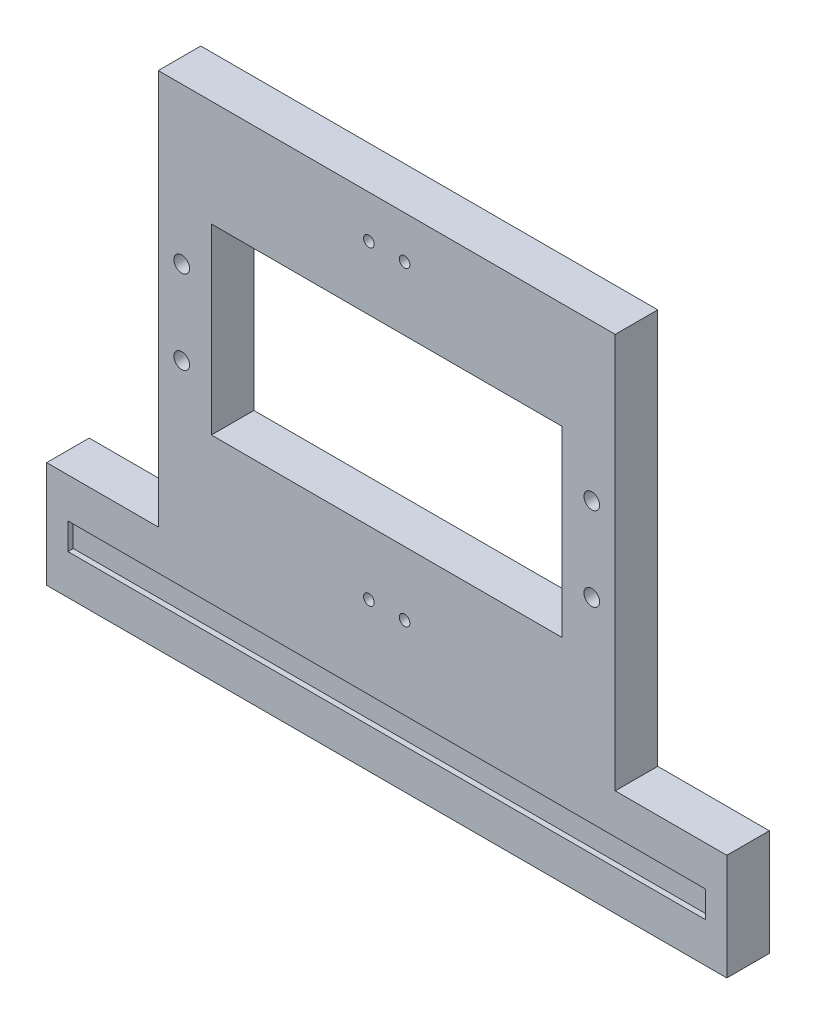
ISO-10303-21;
HEADER;
FILE_DESCRIPTION(('STEP AP214'),'2;1');
FILE_NAME('part.step','',(''),(''),'','','');
FILE_SCHEMA(('AUTOMOTIVE_DESIGN { 1 0 10303 214 1 1 1 1 }'));
ENDSEC;
DATA;
#1=APPLICATION_CONTEXT('core data for automotive mechanical design processes');
#2=APPLICATION_PROTOCOL_DEFINITION('international standard','automotive_design',2000,#1);
#3=PRODUCT_CONTEXT('',#1,'mechanical');
#4=PRODUCT('Part','Part','',(#3));
#5=PRODUCT_RELATED_PRODUCT_CATEGORY('part','',(#4));
#6=PRODUCT_DEFINITION_FORMATION('','',#4);
#7=PRODUCT_DEFINITION_CONTEXT('part definition',#1,'design');
#8=PRODUCT_DEFINITION('design','',#6,#7);
#9=PRODUCT_DEFINITION_SHAPE('','',#8);
#10=(LENGTH_UNIT() NAMED_UNIT(*) SI_UNIT(.MILLI.,.METRE.));
#11=(NAMED_UNIT(*) PLANE_ANGLE_UNIT() SI_UNIT($,.RADIAN.));
#12=(NAMED_UNIT(*) SI_UNIT($,.STERADIAN.) SOLID_ANGLE_UNIT());
#13=UNCERTAINTY_MEASURE_WITH_UNIT(LENGTH_MEASURE(1.E-05),#10,'distance_accuracy_value','');
#14=(GEOMETRIC_REPRESENTATION_CONTEXT(3) GLOBAL_UNCERTAINTY_ASSIGNED_CONTEXT((#13)) GLOBAL_UNIT_ASSIGNED_CONTEXT((#10,
#11,#12)) REPRESENTATION_CONTEXT('',''));
#15=CARTESIAN_POINT('',(0.,0.,0.));
#16=DIRECTION('',(0.,0.,1.));
#17=DIRECTION('',(1.,0.,0.));
#18=AXIS2_PLACEMENT_3D('',#15,#16,#17);
#19=CARTESIAN_POINT('',(0.,0.,5.08));
#20=DIRECTION('',(0.,0.,-1.));
#21=DIRECTION('',(-1.,0.,0.));
#22=AXIS2_PLACEMENT_3D('',#19,#20,#21);
#23=PLANE('',#22);
#24=DIRECTION('',(1.,0.,0.));
#25=VECTOR('',#24,1.);
#26=CARTESIAN_POINT('',(-10.795,-7.9375,5.08));
#27=LINE('',#26,#25);
#28=CARTESIAN_POINT('',(-10.795,-7.9375,5.08));
#29=VERTEX_POINT('',#28);
#30=CARTESIAN_POINT('',(65.405,-7.9375,5.08));
#31=VERTEX_POINT('',#30);
#32=EDGE_CURVE('E177',#29,#31,#27,.T.);
#33=ORIENTED_EDGE('',*,*,#32,.F.);
#34=DIRECTION('',(0.,-1.,0.));
#35=VECTOR('',#34,1.);
#36=CARTESIAN_POINT('',(-10.795,-4.7625,5.08));
#37=LINE('',#36,#35);
#38=CARTESIAN_POINT('',(-10.795,-4.7625,5.08));
#39=VERTEX_POINT('',#38);
#40=EDGE_CURVE('E50',#39,#29,#37,.T.);
#41=ORIENTED_EDGE('',*,*,#40,.F.);
#42=DIRECTION('',(-1.,0.,0.));
#43=VECTOR('',#42,1.);
#44=CARTESIAN_POINT('',(-10.795,-4.7625,5.08));
#45=LINE('',#44,#43);
#46=CARTESIAN_POINT('',(65.405,-4.7625,5.08));
#47=VERTEX_POINT('',#46);
#48=EDGE_CURVE('E168',#47,#39,#45,.T.);
#49=ORIENTED_EDGE('',*,*,#48,.F.);
#50=DIRECTION('',(0.,1.,0.));
#51=VECTOR('',#50,1.);
#52=CARTESIAN_POINT('',(65.405,-4.7625,5.08));
#53=LINE('',#52,#51);
#54=EDGE_CURVE('E171',#31,#47,#53,.T.);
#55=ORIENTED_EDGE('',*,*,#54,.F.);
#56=EDGE_LOOP('',(#33,#41,#49,#55));
#57=FACE_BOUND('',#56,.T.);
#58=CARTESIAN_POINT('',(25.17521,42.164,5.08));
#59=DIRECTION('',(0.,0.,1.));
#60=DIRECTION('',(1.,0.,0.));
#61=AXIS2_PLACEMENT_3D('',#58,#59,#60);
#62=CIRCLE('',#61,0.634999999999999);
#63=CARTESIAN_POINT('',(25.81021,42.164,5.08));
#64=VERTEX_POINT('',#63);
#65=EDGE_CURVE('E223',#64,#64,#62,.T.);
#66=ORIENTED_EDGE('',*,*,#65,.F.);
#67=EDGE_LOOP('',(#66));
#68=FACE_BOUND('',#67,.T.);
#69=CARTESIAN_POINT('',(29.43479,42.164,5.08));
#70=DIRECTION('',(0.,0.,1.));
#71=DIRECTION('',(1.,0.,0.));
#72=AXIS2_PLACEMENT_3D('',#69,#70,#71);
#73=CIRCLE('',#72,0.634999999999996);
#74=CARTESIAN_POINT('',(30.06979,42.164,5.08));
#75=VERTEX_POINT('',#74);
#76=EDGE_CURVE('E631',#75,#75,#73,.T.);
#77=ORIENTED_EDGE('',*,*,#76,.F.);
#78=EDGE_LOOP('',(#77));
#79=FACE_BOUND('',#78,.T.);
#80=CARTESIAN_POINT('',(29.43479,5.08,5.08));
#81=DIRECTION('',(0.,0.,1.));
#82=DIRECTION('',(1.,0.,0.));
#83=AXIS2_PLACEMENT_3D('',#80,#81,#82);
#84=CIRCLE('',#83,0.634999999999995);
#85=CARTESIAN_POINT('',(30.06979,5.08,5.08));
#86=VERTEX_POINT('',#85);
#87=EDGE_CURVE('E625',#86,#86,#84,.T.);
#88=ORIENTED_EDGE('',*,*,#87,.F.);
#89=EDGE_LOOP('',(#88));
#90=FACE_BOUND('',#89,.T.);
#91=CARTESIAN_POINT('',(25.17521,5.08,5.08));
#92=DIRECTION('',(0.,0.,1.));
#93=DIRECTION('',(1.,0.,0.));
#94=AXIS2_PLACEMENT_3D('',#91,#92,#93);
#95=CIRCLE('',#94,0.634999999999999);
#96=CARTESIAN_POINT('',(25.81021,5.08,5.08));
#97=VERTEX_POINT('',#96);
#98=EDGE_CURVE('E619',#97,#97,#95,.T.);
#99=ORIENTED_EDGE('',*,*,#98,.F.);
#100=EDGE_LOOP('',(#99));
#101=FACE_BOUND('',#100,.T.);
#102=CARTESIAN_POINT('',(51.80457,18.62201,5.08));
#103=DIRECTION('',(0.,0.,1.));
#104=DIRECTION('',(1.,0.,0.));
#105=AXIS2_PLACEMENT_3D('',#102,#103,#104);
#106=CIRCLE('',#105,0.935990000000007);
#107=CARTESIAN_POINT('',(52.74056,18.62201,5.08));
#108=VERTEX_POINT('',#107);
#109=EDGE_CURVE('E613',#108,#108,#106,.T.);
#110=ORIENTED_EDGE('',*,*,#109,.F.);
#111=EDGE_LOOP('',(#110));
#112=FACE_BOUND('',#111,.T.);
#113=CARTESIAN_POINT('',(51.80457,28.62199,5.08));
#114=DIRECTION('',(0.,0.,1.));
#115=DIRECTION('',(1.,0.,0.));
#116=AXIS2_PLACEMENT_3D('',#113,#114,#115);
#117=CIRCLE('',#116,0.935990000000007);
#118=CARTESIAN_POINT('',(52.74056,28.62199,5.08));
#119=VERTEX_POINT('',#118);
#120=EDGE_CURVE('E607',#119,#119,#117,.T.);
#121=ORIENTED_EDGE('',*,*,#120,.F.);
#122=EDGE_LOOP('',(#121));
#123=FACE_BOUND('',#122,.T.);
#124=CARTESIAN_POINT('',(2.80543,18.62201,5.08));
#125=DIRECTION('',(0.,0.,1.));
#126=DIRECTION('',(1.,0.,0.));
#127=AXIS2_PLACEMENT_3D('',#124,#125,#126);
#128=CIRCLE('',#127,0.935990000000001);
#129=CARTESIAN_POINT('',(3.74142,18.62201,5.08));
#130=VERTEX_POINT('',#129);
#131=EDGE_CURVE('E601',#130,#130,#128,.T.);
#132=ORIENTED_EDGE('',*,*,#131,.F.);
#133=EDGE_LOOP('',(#132));
#134=FACE_BOUND('',#133,.T.);
#135=CARTESIAN_POINT('',(2.80543,28.62199,5.08));
#136=DIRECTION('',(0.,0.,1.));
#137=DIRECTION('',(1.,0.,0.));
#138=AXIS2_PLACEMENT_3D('',#135,#136,#137);
#139=CIRCLE('',#138,0.935990000000001);
#140=CARTESIAN_POINT('',(3.74142,28.62199,5.08));
#141=VERTEX_POINT('',#140);
#142=EDGE_CURVE('E595',#141,#141,#139,.T.);
#143=ORIENTED_EDGE('',*,*,#142,.F.);
#144=EDGE_LOOP('',(#143));
#145=FACE_BOUND('',#144,.T.);
#146=DIRECTION('',(0.,-1.,0.));
#147=VECTOR('',#146,1.);
#148=CARTESIAN_POINT('',(0.,0.,5.08));
#149=LINE('',#148,#147);
#150=CARTESIAN_POINT('',(0.,47.244,5.08));
#151=VERTEX_POINT('',#150);
#152=CARTESIAN_POINT('',(0.,0.,5.08));
#153=VERTEX_POINT('',#152);
#154=EDGE_CURVE('E250',#151,#153,#149,.T.);
#155=ORIENTED_EDGE('',*,*,#154,.T.);
#156=DIRECTION('',(-1.,0.,0.));
#157=VECTOR('',#156,1.);
#158=CARTESIAN_POINT('',(67.945,0.,5.08));
#159=LINE('',#158,#157);
#160=CARTESIAN_POINT('',(-13.335,0.,5.08));
#161=VERTEX_POINT('',#160);
#162=EDGE_CURVE('E183',#153,#161,#159,.T.);
#163=ORIENTED_EDGE('',*,*,#162,.T.);
#164=DIRECTION('',(0.,-1.,0.));
#165=VECTOR('',#164,1.);
#166=CARTESIAN_POINT('',(-13.335,0.,5.08));
#167=LINE('',#166,#165);
#168=CARTESIAN_POINT('',(-13.335,-12.7,5.08));
#169=VERTEX_POINT('',#168);
#170=EDGE_CURVE('E198',#161,#169,#167,.T.);
#171=ORIENTED_EDGE('',*,*,#170,.T.);
#172=DIRECTION('',(1.,0.,0.));
#173=VECTOR('',#172,1.);
#174=CARTESIAN_POINT('',(-13.335,-12.7,5.08));
#175=LINE('',#174,#173);
#176=CARTESIAN_POINT('',(67.945,-12.7,5.08));
#177=VERTEX_POINT('',#176);
#178=EDGE_CURVE('E560',#169,#177,#175,.T.);
#179=ORIENTED_EDGE('',*,*,#178,.T.);
#180=DIRECTION('',(0.,1.,0.));
#181=VECTOR('',#180,1.);
#182=CARTESIAN_POINT('',(67.945,-12.7,5.08));
#183=LINE('',#182,#181);
#184=CARTESIAN_POINT('',(67.945,0.,5.08));
#185=VERTEX_POINT('',#184);
#186=EDGE_CURVE('E189',#177,#185,#183,.T.);
#187=ORIENTED_EDGE('',*,*,#186,.T.);
#188=CARTESIAN_POINT('',(54.61,0.,5.08));
#189=VERTEX_POINT('',#188);
#190=EDGE_CURVE('E195',#185,#189,#159,.T.);
#191=ORIENTED_EDGE('',*,*,#190,.T.);
#192=DIRECTION('',(0.,1.,0.));
#193=VECTOR('',#192,1.);
#194=CARTESIAN_POINT('',(54.61,0.,5.08));
#195=LINE('',#194,#193);
#196=CARTESIAN_POINT('',(54.61,47.244,5.08));
#197=VERTEX_POINT('',#196);
#198=EDGE_CURVE('E257',#189,#197,#195,.T.);
#199=ORIENTED_EDGE('',*,*,#198,.T.);
#200=DIRECTION('',(-1.,0.,0.));
#201=VECTOR('',#200,1.);
#202=CARTESIAN_POINT('',(0.,47.244,5.08));
#203=LINE('',#202,#201);
#204=EDGE_CURVE('E259',#197,#151,#203,.T.);
#205=ORIENTED_EDGE('',*,*,#204,.T.);
#206=EDGE_LOOP('',(#155,#163,#171,#179,#187,#191,#199,#205));
#207=FACE_BOUND('',#206,.T.);
#208=DIRECTION('',(0.,-1.,0.));
#209=VECTOR('',#208,1.);
#210=CARTESIAN_POINT('',(6.35,12.7,5.08));
#211=LINE('',#210,#209);
#212=CARTESIAN_POINT('',(6.35,34.544,5.08));
#213=VERTEX_POINT('',#212);
#214=CARTESIAN_POINT('',(6.35,12.7,5.08));
#215=VERTEX_POINT('',#214);
#216=EDGE_CURVE('E578',#213,#215,#211,.T.);
#217=ORIENTED_EDGE('',*,*,#216,.F.);
#218=DIRECTION('',(-1.,0.,0.));
#219=VECTOR('',#218,1.);
#220=CARTESIAN_POINT('',(6.35,34.544,5.08));
#221=LINE('',#220,#219);
#222=CARTESIAN_POINT('',(48.26,34.544,5.08));
#223=VERTEX_POINT('',#222);
#224=EDGE_CURVE('E574',#223,#213,#221,.T.);
#225=ORIENTED_EDGE('',*,*,#224,.F.);
#226=DIRECTION('',(0.,1.,0.));
#227=VECTOR('',#226,1.);
#228=CARTESIAN_POINT('',(48.26,12.7,5.08));
#229=LINE('',#228,#227);
#230=CARTESIAN_POINT('',(48.26,12.7,5.08));
#231=VERTEX_POINT('',#230);
#232=EDGE_CURVE('E590',#231,#223,#229,.T.);
#233=ORIENTED_EDGE('',*,*,#232,.F.);
#234=DIRECTION('',(1.,0.,0.));
#235=VECTOR('',#234,1.);
#236=CARTESIAN_POINT('',(6.35,12.7,5.08));
#237=LINE('',#236,#235);
#238=EDGE_CURVE('E592',#215,#231,#237,.T.);
#239=ORIENTED_EDGE('',*,*,#238,.F.);
#240=EDGE_LOOP('',(#217,#225,#233,#239));
#241=FACE_BOUND('',#240,.T.);
#242=ADVANCED_FACE('F33',(#57,#68,#79,#90,#101,#112,#123,#134,#145,#207,#241),#23,.F.);
#243=CARTESIAN_POINT('',(0.,0.,0.));
#244=DIRECTION('',(0.,0.,-1.));
#245=DIRECTION('',(-1.,0.,0.));
#246=AXIS2_PLACEMENT_3D('',#243,#244,#245);
#247=PLANE('',#246);
#248=CARTESIAN_POINT('',(25.17521,42.164,0.));
#249=DIRECTION('',(0.,0.,1.));
#250=DIRECTION('',(1.,0.,0.));
#251=AXIS2_PLACEMENT_3D('',#248,#249,#250);
#252=CIRCLE('',#251,0.634999999999999);
#253=CARTESIAN_POINT('',(25.81021,42.164,0.));
#254=VERTEX_POINT('',#253);
#255=EDGE_CURVE('E229',#254,#254,#252,.T.);
#256=ORIENTED_EDGE('',*,*,#255,.T.);
#257=EDGE_LOOP('',(#256));
#258=FACE_BOUND('',#257,.T.);
#259=CARTESIAN_POINT('',(29.43479,42.164,0.));
#260=DIRECTION('',(0.,0.,1.));
#261=DIRECTION('',(1.,0.,0.));
#262=AXIS2_PLACEMENT_3D('',#259,#260,#261);
#263=CIRCLE('',#262,0.634999999999996);
#264=CARTESIAN_POINT('',(30.06979,42.164,0.));
#265=VERTEX_POINT('',#264);
#266=EDGE_CURVE('E628',#265,#265,#263,.T.);
#267=ORIENTED_EDGE('',*,*,#266,.T.);
#268=EDGE_LOOP('',(#267));
#269=FACE_BOUND('',#268,.T.);
#270=CARTESIAN_POINT('',(29.43479,5.08,0.));
#271=DIRECTION('',(0.,0.,1.));
#272=DIRECTION('',(1.,0.,0.));
#273=AXIS2_PLACEMENT_3D('',#270,#271,#272);
#274=CIRCLE('',#273,0.634999999999995);
#275=CARTESIAN_POINT('',(30.06979,5.08,0.));
#276=VERTEX_POINT('',#275);
#277=EDGE_CURVE('E622',#276,#276,#274,.T.);
#278=ORIENTED_EDGE('',*,*,#277,.T.);
#279=EDGE_LOOP('',(#278));
#280=FACE_BOUND('',#279,.T.);
#281=CARTESIAN_POINT('',(25.17521,5.08,0.));
#282=DIRECTION('',(0.,0.,1.));
#283=DIRECTION('',(1.,0.,0.));
#284=AXIS2_PLACEMENT_3D('',#281,#282,#283);
#285=CIRCLE('',#284,0.634999999999999);
#286=CARTESIAN_POINT('',(25.81021,5.08,0.));
#287=VERTEX_POINT('',#286);
#288=EDGE_CURVE('E616',#287,#287,#285,.T.);
#289=ORIENTED_EDGE('',*,*,#288,.T.);
#290=EDGE_LOOP('',(#289));
#291=FACE_BOUND('',#290,.T.);
#292=CARTESIAN_POINT('',(51.80457,18.62201,0.));
#293=DIRECTION('',(0.,0.,1.));
#294=DIRECTION('',(1.,0.,0.));
#295=AXIS2_PLACEMENT_3D('',#292,#293,#294);
#296=CIRCLE('',#295,0.935990000000007);
#297=CARTESIAN_POINT('',(52.74056,18.62201,0.));
#298=VERTEX_POINT('',#297);
#299=EDGE_CURVE('E610',#298,#298,#296,.T.);
#300=ORIENTED_EDGE('',*,*,#299,.T.);
#301=EDGE_LOOP('',(#300));
#302=FACE_BOUND('',#301,.T.);
#303=CARTESIAN_POINT('',(51.80457,28.62199,0.));
#304=DIRECTION('',(0.,0.,1.));
#305=DIRECTION('',(1.,0.,0.));
#306=AXIS2_PLACEMENT_3D('',#303,#304,#305);
#307=CIRCLE('',#306,0.935990000000007);
#308=CARTESIAN_POINT('',(52.74056,28.62199,0.));
#309=VERTEX_POINT('',#308);
#310=EDGE_CURVE('E604',#309,#309,#307,.T.);
#311=ORIENTED_EDGE('',*,*,#310,.T.);
#312=EDGE_LOOP('',(#311));
#313=FACE_BOUND('',#312,.T.);
#314=CARTESIAN_POINT('',(2.80543,18.62201,0.));
#315=DIRECTION('',(0.,0.,1.));
#316=DIRECTION('',(1.,0.,0.));
#317=AXIS2_PLACEMENT_3D('',#314,#315,#316);
#318=CIRCLE('',#317,0.935990000000001);
#319=CARTESIAN_POINT('',(3.74142,18.62201,0.));
#320=VERTEX_POINT('',#319);
#321=EDGE_CURVE('E598',#320,#320,#318,.T.);
#322=ORIENTED_EDGE('',*,*,#321,.T.);
#323=EDGE_LOOP('',(#322));
#324=FACE_BOUND('',#323,.T.);
#325=CARTESIAN_POINT('',(2.80543,28.62199,0.));
#326=DIRECTION('',(0.,0.,1.));
#327=DIRECTION('',(1.,0.,0.));
#328=AXIS2_PLACEMENT_3D('',#325,#326,#327);
#329=CIRCLE('',#328,0.935990000000001);
#330=CARTESIAN_POINT('',(3.74142,28.62199,0.));
#331=VERTEX_POINT('',#330);
#332=EDGE_CURVE('E588',#331,#331,#329,.T.);
#333=ORIENTED_EDGE('',*,*,#332,.T.);
#334=EDGE_LOOP('',(#333));
#335=FACE_BOUND('',#334,.T.);
#336=DIRECTION('',(0.,-1.,0.));
#337=VECTOR('',#336,1.);
#338=CARTESIAN_POINT('',(0.,0.,0.));
#339=LINE('',#338,#337);
#340=CARTESIAN_POINT('',(0.,47.244,0.));
#341=VERTEX_POINT('',#340);
#342=CARTESIAN_POINT('',(0.,0.,0.));
#343=VERTEX_POINT('',#342);
#344=EDGE_CURVE('E249',#341,#343,#339,.T.);
#345=ORIENTED_EDGE('',*,*,#344,.F.);
#346=DIRECTION('',(-1.,0.,0.));
#347=VECTOR('',#346,1.);
#348=CARTESIAN_POINT('',(0.,47.244,0.));
#349=LINE('',#348,#347);
#350=CARTESIAN_POINT('',(54.61,47.244,0.));
#351=VERTEX_POINT('',#350);
#352=EDGE_CURVE('E245',#351,#341,#349,.T.);
#353=ORIENTED_EDGE('',*,*,#352,.F.);
#354=DIRECTION('',(0.,1.,0.));
#355=VECTOR('',#354,1.);
#356=CARTESIAN_POINT('',(54.61,0.,0.));
#357=LINE('',#356,#355);
#358=CARTESIAN_POINT('',(54.61,0.,0.));
#359=VERTEX_POINT('',#358);
#360=EDGE_CURVE('E244',#359,#351,#357,.T.);
#361=ORIENTED_EDGE('',*,*,#360,.F.);
#362=DIRECTION('',(-1.,0.,0.));
#363=VECTOR('',#362,1.);
#364=CARTESIAN_POINT('',(67.945,0.,0.));
#365=LINE('',#364,#363);
#366=CARTESIAN_POINT('',(67.945,0.,0.));
#367=VERTEX_POINT('',#366);
#368=EDGE_CURVE('E202',#367,#359,#365,.T.);
#369=ORIENTED_EDGE('',*,*,#368,.F.);
#370=DIRECTION('',(0.,1.,0.));
#371=VECTOR('',#370,1.);
#372=CARTESIAN_POINT('',(67.945,-12.7,0.));
#373=LINE('',#372,#371);
#374=CARTESIAN_POINT('',(67.945,-12.7,0.));
#375=VERTEX_POINT('',#374);
#376=EDGE_CURVE('E210',#375,#367,#373,.T.);
#377=ORIENTED_EDGE('',*,*,#376,.F.);
#378=DIRECTION('',(1.,0.,0.));
#379=VECTOR('',#378,1.);
#380=CARTESIAN_POINT('',(-13.335,-12.7,0.));
#381=LINE('',#380,#379);
#382=CARTESIAN_POINT('',(-13.335,-12.7,0.));
#383=VERTEX_POINT('',#382);
#384=EDGE_CURVE('E215',#383,#375,#381,.T.);
#385=ORIENTED_EDGE('',*,*,#384,.F.);
#386=DIRECTION('',(0.,-1.,0.));
#387=VECTOR('',#386,1.);
#388=CARTESIAN_POINT('',(-13.335,0.,0.));
#389=LINE('',#388,#387);
#390=CARTESIAN_POINT('',(-13.335,0.,0.));
#391=VERTEX_POINT('',#390);
#392=EDGE_CURVE('E208',#391,#383,#389,.T.);
#393=ORIENTED_EDGE('',*,*,#392,.F.);
#394=EDGE_CURVE('E199',#343,#391,#365,.T.);
#395=ORIENTED_EDGE('',*,*,#394,.F.);
#396=EDGE_LOOP('',(#345,#353,#361,#369,#377,#385,#393,#395));
#397=FACE_BOUND('',#396,.T.);
#398=DIRECTION('',(-1.,0.,0.));
#399=VECTOR('',#398,1.);
#400=CARTESIAN_POINT('',(6.35,34.544,0.));
#401=LINE('',#400,#399);
#402=CARTESIAN_POINT('',(48.26,34.544,0.));
#403=VERTEX_POINT('',#402);
#404=CARTESIAN_POINT('',(6.35,34.544,0.));
#405=VERTEX_POINT('',#404);
#406=EDGE_CURVE('E575',#403,#405,#401,.T.);
#407=ORIENTED_EDGE('',*,*,#406,.T.);
#408=DIRECTION('',(0.,-1.,0.));
#409=VECTOR('',#408,1.);
#410=CARTESIAN_POINT('',(6.35,12.7,0.));
#411=LINE('',#410,#409);
#412=CARTESIAN_POINT('',(6.35,12.7,0.));
#413=VERTEX_POINT('',#412);
#414=EDGE_CURVE('E585',#405,#413,#411,.T.);
#415=ORIENTED_EDGE('',*,*,#414,.T.);
#416=DIRECTION('',(1.,0.,0.));
#417=VECTOR('',#416,1.);
#418=CARTESIAN_POINT('',(6.35,12.7,0.));
#419=LINE('',#418,#417);
#420=CARTESIAN_POINT('',(48.26,12.7,0.));
#421=VERTEX_POINT('',#420);
#422=EDGE_CURVE('E582',#413,#421,#419,.T.);
#423=ORIENTED_EDGE('',*,*,#422,.T.);
#424=DIRECTION('',(0.,1.,0.));
#425=VECTOR('',#424,1.);
#426=CARTESIAN_POINT('',(48.26,12.7,0.));
#427=LINE('',#426,#425);
#428=EDGE_CURVE('E579',#421,#403,#427,.T.);
#429=ORIENTED_EDGE('',*,*,#428,.T.);
#430=EDGE_LOOP('',(#407,#415,#423,#429));
#431=FACE_BOUND('',#430,.T.);
#432=ADVANCED_FACE('F240',(#258,#269,#280,#291,#302,#313,#324,#335,#397,#431),#247,.T.);
#433=CARTESIAN_POINT('',(0.,0.,5.08));
#434=DIRECTION('',(1.,0.,0.));
#435=DIRECTION('',(0.,0.,-1.));
#436=AXIS2_PLACEMENT_3D('',#433,#434,#435);
#437=PLANE('',#436);
#438=ORIENTED_EDGE('',*,*,#344,.T.);
#439=DIRECTION('',(0.,0.,-1.));
#440=VECTOR('',#439,1.);
#441=CARTESIAN_POINT('',(0.,0.,5.08));
#442=LINE('',#441,#440);
#443=EDGE_CURVE('E11',#153,#343,#442,.T.);
#444=ORIENTED_EDGE('',*,*,#443,.F.);
#445=ORIENTED_EDGE('',*,*,#154,.F.);
#446=DIRECTION('',(0.,0.,-1.));
#447=VECTOR('',#446,1.);
#448=CARTESIAN_POINT('',(0.,47.244,5.08));
#449=LINE('',#448,#447);
#450=EDGE_CURVE('E563',#151,#341,#449,.T.);
#451=ORIENTED_EDGE('',*,*,#450,.T.);
#452=EDGE_LOOP('',(#438,#444,#445,#451));
#453=FACE_BOUND('',#452,.T.);
#454=ADVANCED_FACE('F35',(#453),#437,.F.);
#455=CARTESIAN_POINT('',(54.61,0.,5.08));
#456=DIRECTION('',(-1.,0.,0.));
#457=DIRECTION('',(0.,0.,1.));
#458=AXIS2_PLACEMENT_3D('',#455,#456,#457);
#459=PLANE('',#458);
#460=ORIENTED_EDGE('',*,*,#360,.T.);
#461=DIRECTION('',(0.,0.,-1.));
#462=VECTOR('',#461,1.);
#463=CARTESIAN_POINT('',(54.61,47.244,5.08));
#464=LINE('',#463,#462);
#465=EDGE_CURVE('E262',#197,#351,#464,.T.);
#466=ORIENTED_EDGE('',*,*,#465,.F.);
#467=ORIENTED_EDGE('',*,*,#198,.F.);
#468=DIRECTION('',(0.,0.,-1.));
#469=VECTOR('',#468,1.);
#470=CARTESIAN_POINT('',(54.61,0.,5.08));
#471=LINE('',#470,#469);
#472=EDGE_CURVE('E42',#189,#359,#471,.T.);
#473=ORIENTED_EDGE('',*,*,#472,.T.);
#474=EDGE_LOOP('',(#460,#466,#467,#473));
#475=FACE_BOUND('',#474,.T.);
#476=ADVANCED_FACE('F313',(#475),#459,.F.);
#477=CARTESIAN_POINT('',(0.,47.244,5.08));
#478=DIRECTION('',(0.,-1.,0.));
#479=DIRECTION('',(0.,0.,-1.));
#480=AXIS2_PLACEMENT_3D('',#477,#478,#479);
#481=PLANE('',#480);
#482=ORIENTED_EDGE('',*,*,#352,.T.);
#483=ORIENTED_EDGE('',*,*,#450,.F.);
#484=ORIENTED_EDGE('',*,*,#204,.F.);
#485=ORIENTED_EDGE('',*,*,#465,.T.);
#486=EDGE_LOOP('',(#482,#483,#484,#485));
#487=FACE_BOUND('',#486,.T.);
#488=ADVANCED_FACE('F311',(#487),#481,.F.);
#489=CARTESIAN_POINT('',(6.35,12.7,5.08));
#490=DIRECTION('',(1.,0.,0.));
#491=DIRECTION('',(0.,0.,-1.));
#492=AXIS2_PLACEMENT_3D('',#489,#490,#491);
#493=PLANE('',#492);
#494=ORIENTED_EDGE('',*,*,#414,.F.);
#495=DIRECTION('',(0.,0.,-1.));
#496=VECTOR('',#495,1.);
#497=CARTESIAN_POINT('',(6.35,34.544,5.08));
#498=LINE('',#497,#496);
#499=EDGE_CURVE('E571',#213,#405,#498,.T.);
#500=ORIENTED_EDGE('',*,*,#499,.F.);
#501=ORIENTED_EDGE('',*,*,#216,.T.);
#502=DIRECTION('',(0.,0.,-1.));
#503=VECTOR('',#502,1.);
#504=CARTESIAN_POINT('',(6.35,12.7,5.08));
#505=LINE('',#504,#503);
#506=EDGE_CURVE('E252',#215,#413,#505,.T.);
#507=ORIENTED_EDGE('',*,*,#506,.T.);
#508=EDGE_LOOP('',(#494,#500,#501,#507));
#509=FACE_BOUND('',#508,.T.);
#510=ADVANCED_FACE('F308',(#509),#493,.T.);
#511=CARTESIAN_POINT('',(6.35,12.7,5.08));
#512=DIRECTION('',(0.,1.,0.));
#513=DIRECTION('',(0.,0.,1.));
#514=AXIS2_PLACEMENT_3D('',#511,#512,#513);
#515=PLANE('',#514);
#516=ORIENTED_EDGE('',*,*,#422,.F.);
#517=ORIENTED_EDGE('',*,*,#506,.F.);
#518=ORIENTED_EDGE('',*,*,#238,.T.);
#519=DIRECTION('',(0.,0.,-1.));
#520=VECTOR('',#519,1.);
#521=CARTESIAN_POINT('',(48.26,12.7,5.08));
#522=LINE('',#521,#520);
#523=EDGE_CURVE('E568',#231,#421,#522,.T.);
#524=ORIENTED_EDGE('',*,*,#523,.T.);
#525=EDGE_LOOP('',(#516,#517,#518,#524));
#526=FACE_BOUND('',#525,.T.);
#527=ADVANCED_FACE('F426',(#526),#515,.T.);
#528=CARTESIAN_POINT('',(48.26,12.7,5.08));
#529=DIRECTION('',(-1.,0.,0.));
#530=DIRECTION('',(0.,0.,1.));
#531=AXIS2_PLACEMENT_3D('',#528,#529,#530);
#532=PLANE('',#531);
#533=ORIENTED_EDGE('',*,*,#428,.F.);
#534=ORIENTED_EDGE('',*,*,#523,.F.);
#535=ORIENTED_EDGE('',*,*,#232,.T.);
#536=DIRECTION('',(0.,0.,-1.));
#537=VECTOR('',#536,1.);
#538=CARTESIAN_POINT('',(48.26,34.544,5.08));
#539=LINE('',#538,#537);
#540=EDGE_CURVE('E58',#223,#403,#539,.T.);
#541=ORIENTED_EDGE('',*,*,#540,.T.);
#542=EDGE_LOOP('',(#533,#534,#535,#541));
#543=FACE_BOUND('',#542,.T.);
#544=ADVANCED_FACE('F417',(#543),#532,.T.);
#545=CARTESIAN_POINT('',(6.35,34.544,5.08));
#546=DIRECTION('',(0.,-1.,0.));
#547=DIRECTION('',(0.,0.,-1.));
#548=AXIS2_PLACEMENT_3D('',#545,#546,#547);
#549=PLANE('',#548);
#550=ORIENTED_EDGE('',*,*,#406,.F.);
#551=ORIENTED_EDGE('',*,*,#540,.F.);
#552=ORIENTED_EDGE('',*,*,#224,.T.);
#553=ORIENTED_EDGE('',*,*,#499,.T.);
#554=EDGE_LOOP('',(#550,#551,#552,#553));
#555=FACE_BOUND('',#554,.T.);
#556=ADVANCED_FACE('F407',(#555),#549,.T.);
#557=CARTESIAN_POINT('',(2.80543,28.62199,0.));
#558=DIRECTION('',(0.,0.,1.));
#559=DIRECTION('',(1.,0.,0.));
#560=AXIS2_PLACEMENT_3D('',#557,#558,#559);
#561=CYLINDRICAL_SURFACE('',#560,0.935990000000001);
#562=ORIENTED_EDGE('',*,*,#332,.F.);
#563=EDGE_LOOP('',(#562));
#564=FACE_BOUND('',#563,.T.);
#565=ORIENTED_EDGE('',*,*,#142,.T.);
#566=EDGE_LOOP('',(#565));
#567=FACE_BOUND('',#566,.T.);
#568=ADVANCED_FACE('F397',(#564,#567),#561,.F.);
#569=CARTESIAN_POINT('',(2.80543,18.62201,0.));
#570=DIRECTION('',(0.,0.,1.));
#571=DIRECTION('',(1.,0.,0.));
#572=AXIS2_PLACEMENT_3D('',#569,#570,#571);
#573=CYLINDRICAL_SURFACE('',#572,0.935990000000001);
#574=ORIENTED_EDGE('',*,*,#321,.F.);
#575=EDGE_LOOP('',(#574));
#576=FACE_BOUND('',#575,.T.);
#577=ORIENTED_EDGE('',*,*,#131,.T.);
#578=EDGE_LOOP('',(#577));
#579=FACE_BOUND('',#578,.T.);
#580=ADVANCED_FACE('F387',(#576,#579),#573,.F.);
#581=CARTESIAN_POINT('',(51.80457,28.62199,0.));
#582=DIRECTION('',(0.,0.,1.));
#583=DIRECTION('',(1.,0.,0.));
#584=AXIS2_PLACEMENT_3D('',#581,#582,#583);
#585=CYLINDRICAL_SURFACE('',#584,0.935990000000007);
#586=ORIENTED_EDGE('',*,*,#310,.F.);
#587=EDGE_LOOP('',(#586));
#588=FACE_BOUND('',#587,.T.);
#589=ORIENTED_EDGE('',*,*,#120,.T.);
#590=EDGE_LOOP('',(#589));
#591=FACE_BOUND('',#590,.T.);
#592=ADVANCED_FACE('F377',(#588,#591),#585,.F.);
#593=CARTESIAN_POINT('',(51.80457,18.62201,0.));
#594=DIRECTION('',(0.,0.,1.));
#595=DIRECTION('',(1.,0.,0.));
#596=AXIS2_PLACEMENT_3D('',#593,#594,#595);
#597=CYLINDRICAL_SURFACE('',#596,0.935990000000007);
#598=ORIENTED_EDGE('',*,*,#299,.F.);
#599=EDGE_LOOP('',(#598));
#600=FACE_BOUND('',#599,.T.);
#601=ORIENTED_EDGE('',*,*,#109,.T.);
#602=EDGE_LOOP('',(#601));
#603=FACE_BOUND('',#602,.T.);
#604=ADVANCED_FACE('F367',(#600,#603),#597,.F.);
#605=CARTESIAN_POINT('',(25.17521,5.08,0.));
#606=DIRECTION('',(0.,0.,1.));
#607=DIRECTION('',(1.,0.,0.));
#608=AXIS2_PLACEMENT_3D('',#605,#606,#607);
#609=CYLINDRICAL_SURFACE('',#608,0.634999999999999);
#610=ORIENTED_EDGE('',*,*,#288,.F.);
#611=EDGE_LOOP('',(#610));
#612=FACE_BOUND('',#611,.T.);
#613=ORIENTED_EDGE('',*,*,#98,.T.);
#614=EDGE_LOOP('',(#613));
#615=FACE_BOUND('',#614,.T.);
#616=ADVANCED_FACE('F357',(#612,#615),#609,.F.);
#617=CARTESIAN_POINT('',(29.43479,5.08,0.));
#618=DIRECTION('',(0.,0.,1.));
#619=DIRECTION('',(1.,0.,0.));
#620=AXIS2_PLACEMENT_3D('',#617,#618,#619);
#621=CYLINDRICAL_SURFACE('',#620,0.634999999999995);
#622=ORIENTED_EDGE('',*,*,#277,.F.);
#623=EDGE_LOOP('',(#622));
#624=FACE_BOUND('',#623,.T.);
#625=ORIENTED_EDGE('',*,*,#87,.T.);
#626=EDGE_LOOP('',(#625));
#627=FACE_BOUND('',#626,.T.);
#628=ADVANCED_FACE('F347',(#624,#627),#621,.F.);
#629=CARTESIAN_POINT('',(29.43479,42.164,0.));
#630=DIRECTION('',(0.,0.,1.));
#631=DIRECTION('',(1.,0.,0.));
#632=AXIS2_PLACEMENT_3D('',#629,#630,#631);
#633=CYLINDRICAL_SURFACE('',#632,0.634999999999996);
#634=ORIENTED_EDGE('',*,*,#266,.F.);
#635=EDGE_LOOP('',(#634));
#636=FACE_BOUND('',#635,.T.);
#637=ORIENTED_EDGE('',*,*,#76,.T.);
#638=EDGE_LOOP('',(#637));
#639=FACE_BOUND('',#638,.T.);
#640=ADVANCED_FACE('F337',(#636,#639),#633,.F.);
#641=CARTESIAN_POINT('',(25.17521,42.164,0.));
#642=DIRECTION('',(0.,0.,1.));
#643=DIRECTION('',(1.,0.,0.));
#644=AXIS2_PLACEMENT_3D('',#641,#642,#643);
#645=CYLINDRICAL_SURFACE('',#644,0.634999999999999);
#646=ORIENTED_EDGE('',*,*,#255,.F.);
#647=EDGE_LOOP('',(#646));
#648=FACE_BOUND('',#647,.T.);
#649=ORIENTED_EDGE('',*,*,#65,.T.);
#650=EDGE_LOOP('',(#649));
#651=FACE_BOUND('',#650,.T.);
#652=ADVANCED_FACE('F297',(#648,#651),#645,.F.);
#653=CARTESIAN_POINT('',(67.945,0.,-82.2662044827644));
#654=DIRECTION('',(0.,1.,0.));
#655=DIRECTION('',(-1.,0.,0.));
#656=AXIS2_PLACEMENT_3D('',#653,#654,#655);
#657=PLANE('',#656);
#658=ORIENTED_EDGE('',*,*,#472,.F.);
#659=ORIENTED_EDGE('',*,*,#190,.F.);
#660=DIRECTION('',(0.,0.,1.));
#661=VECTOR('',#660,1.);
#662=CARTESIAN_POINT('',(67.945,0.,-82.2662044827644));
#663=LINE('',#662,#661);
#664=EDGE_CURVE('E203',#367,#185,#663,.T.);
#665=ORIENTED_EDGE('',*,*,#664,.F.);
#666=ORIENTED_EDGE('',*,*,#368,.T.);
#667=EDGE_LOOP('',(#658,#659,#665,#666));
#668=FACE_BOUND('',#667,.T.);
#669=ADVANCED_FACE('F235',(#668),#657,.T.);
#670=CARTESIAN_POINT('',(-13.335,0.,-82.2662044827644));
#671=DIRECTION('',(-1.,0.,0.));
#672=DIRECTION('',(0.,0.,1.));
#673=AXIS2_PLACEMENT_3D('',#670,#671,#672);
#674=PLANE('',#673);
#675=DIRECTION('',(0.,0.,1.));
#676=VECTOR('',#675,1.);
#677=CARTESIAN_POINT('',(-13.335,0.,-82.2662044827644));
#678=LINE('',#677,#676);
#679=EDGE_CURVE('E221',#391,#161,#678,.T.);
#680=ORIENTED_EDGE('',*,*,#679,.F.);
#681=ORIENTED_EDGE('',*,*,#392,.T.);
#682=DIRECTION('',(0.,0.,1.));
#683=VECTOR('',#682,1.);
#684=CARTESIAN_POINT('',(-13.335,-12.7,-82.2662044827644));
#685=LINE('',#684,#683);
#686=EDGE_CURVE('E218',#383,#169,#685,.T.);
#687=ORIENTED_EDGE('',*,*,#686,.T.);
#688=ORIENTED_EDGE('',*,*,#170,.F.);
#689=EDGE_LOOP('',(#680,#681,#687,#688));
#690=FACE_BOUND('',#689,.T.);
#691=ADVANCED_FACE('F296',(#690),#674,.T.);
#692=CARTESIAN_POINT('',(-13.335,-12.7,-82.2662044827644));
#693=DIRECTION('',(0.,-1.,0.));
#694=DIRECTION('',(0.,0.,-1.));
#695=AXIS2_PLACEMENT_3D('',#692,#693,#694);
#696=PLANE('',#695);
#697=ORIENTED_EDGE('',*,*,#686,.F.);
#698=ORIENTED_EDGE('',*,*,#384,.T.);
#699=DIRECTION('',(0.,0.,1.));
#700=VECTOR('',#699,1.);
#701=CARTESIAN_POINT('',(67.945,-12.7,-82.2662044827644));
#702=LINE('',#701,#700);
#703=EDGE_CURVE('E214',#375,#177,#702,.T.);
#704=ORIENTED_EDGE('',*,*,#703,.T.);
#705=ORIENTED_EDGE('',*,*,#178,.F.);
#706=EDGE_LOOP('',(#697,#698,#704,#705));
#707=FACE_BOUND('',#706,.T.);
#708=ADVANCED_FACE('F292',(#707),#696,.T.);
#709=CARTESIAN_POINT('',(67.945,-12.7,-82.2662044827644));
#710=DIRECTION('',(1.,0.,0.));
#711=DIRECTION('',(0.,0.,-1.));
#712=AXIS2_PLACEMENT_3D('',#709,#710,#711);
#713=PLANE('',#712);
#714=ORIENTED_EDGE('',*,*,#703,.F.);
#715=ORIENTED_EDGE('',*,*,#376,.T.);
#716=ORIENTED_EDGE('',*,*,#664,.T.);
#717=ORIENTED_EDGE('',*,*,#186,.F.);
#718=EDGE_LOOP('',(#714,#715,#716,#717));
#719=FACE_BOUND('',#718,.T.);
#720=ADVANCED_FACE('F284',(#719),#713,.T.);
#721=ORIENTED_EDGE('',*,*,#162,.F.);
#722=ORIENTED_EDGE('',*,*,#443,.T.);
#723=ORIENTED_EDGE('',*,*,#394,.T.);
#724=ORIENTED_EDGE('',*,*,#679,.T.);
#725=EDGE_LOOP('',(#721,#722,#723,#724));
#726=FACE_BOUND('',#725,.T.);
#727=ADVANCED_FACE('F282',(#726),#657,.T.);
#728=CARTESIAN_POINT('',(-10.795,-4.7625,4.445));
#729=DIRECTION('',(-1.,0.,0.));
#730=DIRECTION('',(0.,0.,1.));
#731=AXIS2_PLACEMENT_3D('',#728,#729,#730);
#732=PLANE('',#731);
#733=ORIENTED_EDGE('',*,*,#40,.T.);
#734=DIRECTION('',(0.,0.,1.));
#735=VECTOR('',#734,1.);
#736=CARTESIAN_POINT('',(-10.795,-7.9375,4.445));
#737=LINE('',#736,#735);
#738=CARTESIAN_POINT('',(-10.795,-7.9375,4.445));
#739=VERTEX_POINT('',#738);
#740=EDGE_CURVE('E146',#739,#29,#737,.T.);
#741=ORIENTED_EDGE('',*,*,#740,.F.);
#742=DIRECTION('',(0.,-1.,0.));
#743=VECTOR('',#742,1.);
#744=CARTESIAN_POINT('',(-10.795,-4.7625,4.445));
#745=LINE('',#744,#743);
#746=CARTESIAN_POINT('',(-10.795,-4.7625,4.445));
#747=VERTEX_POINT('',#746);
#748=EDGE_CURVE('E150',#747,#739,#745,.T.);
#749=ORIENTED_EDGE('',*,*,#748,.F.);
#750=DIRECTION('',(0.,0.,1.));
#751=VECTOR('',#750,1.);
#752=CARTESIAN_POINT('',(-10.795,-4.7625,4.445));
#753=LINE('',#752,#751);
#754=EDGE_CURVE('E181',#747,#39,#753,.T.);
#755=ORIENTED_EDGE('',*,*,#754,.T.);
#756=EDGE_LOOP('',(#733,#741,#749,#755));
#757=FACE_BOUND('',#756,.T.);
#758=ADVANCED_FACE('F148',(#757),#732,.F.);
#759=CARTESIAN_POINT('',(-10.795,-4.7625,4.445));
#760=DIRECTION('',(0.,1.,0.));
#761=DIRECTION('',(0.,0.,1.));
#762=AXIS2_PLACEMENT_3D('',#759,#760,#761);
#763=PLANE('',#762);
#764=ORIENTED_EDGE('',*,*,#48,.T.);
#765=ORIENTED_EDGE('',*,*,#754,.F.);
#766=DIRECTION('',(-1.,0.,0.));
#767=VECTOR('',#766,1.);
#768=CARTESIAN_POINT('',(-10.795,-4.7625,4.445));
#769=LINE('',#768,#767);
#770=CARTESIAN_POINT('',(65.405,-4.7625,4.445));
#771=VERTEX_POINT('',#770);
#772=EDGE_CURVE('E156',#771,#747,#769,.T.);
#773=ORIENTED_EDGE('',*,*,#772,.F.);
#774=DIRECTION('',(0.,0.,1.));
#775=VECTOR('',#774,1.);
#776=CARTESIAN_POINT('',(65.405,-4.7625,4.445));
#777=LINE('',#776,#775);
#778=EDGE_CURVE('E184',#771,#47,#777,.T.);
#779=ORIENTED_EDGE('',*,*,#778,.T.);
#780=EDGE_LOOP('',(#764,#765,#773,#779));
#781=FACE_BOUND('',#780,.T.);
#782=ADVANCED_FACE('F290',(#781),#763,.F.);
#783=CARTESIAN_POINT('',(65.405,-4.7625,4.445));
#784=DIRECTION('',(1.,0.,0.));
#785=DIRECTION('',(0.,0.,-1.));
#786=AXIS2_PLACEMENT_3D('',#783,#784,#785);
#787=PLANE('',#786);
#788=ORIENTED_EDGE('',*,*,#54,.T.);
#789=ORIENTED_EDGE('',*,*,#778,.F.);
#790=DIRECTION('',(0.,1.,0.));
#791=VECTOR('',#790,1.);
#792=CARTESIAN_POINT('',(65.405,-4.7625,4.445));
#793=LINE('',#792,#791);
#794=CARTESIAN_POINT('',(65.405,-7.9375,4.445));
#795=VERTEX_POINT('',#794);
#796=EDGE_CURVE('E164',#795,#771,#793,.T.);
#797=ORIENTED_EDGE('',*,*,#796,.F.);
#798=DIRECTION('',(0.,0.,1.));
#799=VECTOR('',#798,1.);
#800=CARTESIAN_POINT('',(65.405,-7.9375,4.445));
#801=LINE('',#800,#799);
#802=EDGE_CURVE('E155',#795,#31,#801,.T.);
#803=ORIENTED_EDGE('',*,*,#802,.T.);
#804=EDGE_LOOP('',(#788,#789,#797,#803));
#805=FACE_BOUND('',#804,.T.);
#806=ADVANCED_FACE('F482',(#805),#787,.F.);
#807=CARTESIAN_POINT('',(-10.795,-7.9375,4.445));
#808=DIRECTION('',(0.,-1.,0.));
#809=DIRECTION('',(0.,0.,-1.));
#810=AXIS2_PLACEMENT_3D('',#807,#808,#809);
#811=PLANE('',#810);
#812=ORIENTED_EDGE('',*,*,#32,.T.);
#813=ORIENTED_EDGE('',*,*,#802,.F.);
#814=DIRECTION('',(1.,0.,0.));
#815=VECTOR('',#814,1.);
#816=CARTESIAN_POINT('',(-10.795,-7.9375,4.445));
#817=LINE('',#816,#815);
#818=EDGE_CURVE('E159',#739,#795,#817,.T.);
#819=ORIENTED_EDGE('',*,*,#818,.F.);
#820=ORIENTED_EDGE('',*,*,#740,.T.);
#821=EDGE_LOOP('',(#812,#813,#819,#820));
#822=FACE_BOUND('',#821,.T.);
#823=ADVANCED_FACE('F160',(#822),#811,.F.);
#824=CARTESIAN_POINT('',(0.,0.,4.445));
#825=DIRECTION('',(0.,0.,1.));
#826=DIRECTION('',(1.,0.,0.));
#827=AXIS2_PLACEMENT_3D('',#824,#825,#826);
#828=PLANE('',#827);
#829=ORIENTED_EDGE('',*,*,#748,.T.);
#830=ORIENTED_EDGE('',*,*,#818,.T.);
#831=ORIENTED_EDGE('',*,*,#796,.T.);
#832=ORIENTED_EDGE('',*,*,#772,.T.);
#833=EDGE_LOOP('',(#829,#830,#831,#832));
#834=FACE_BOUND('',#833,.T.);
#835=ADVANCED_FACE('F166',(#834),#828,.T.);
#836=CLOSED_SHELL('',(#242,#432,#454,#476,#488,#510,#527,#544,#556,#568,#580,#592,#604,#616,
#628,#640,#652,#669,#691,#708,#720,#727,#758,#782,#806,#823,#835));
#837=MANIFOLD_SOLID_BREP('B2',#836);
#838=ADVANCED_BREP_SHAPE_REPRESENTATION('',(#18,#837),#14);
#839=SHAPE_DEFINITION_REPRESENTATION(#9,#838);
ENDSEC;
END-ISO-10303-21;
